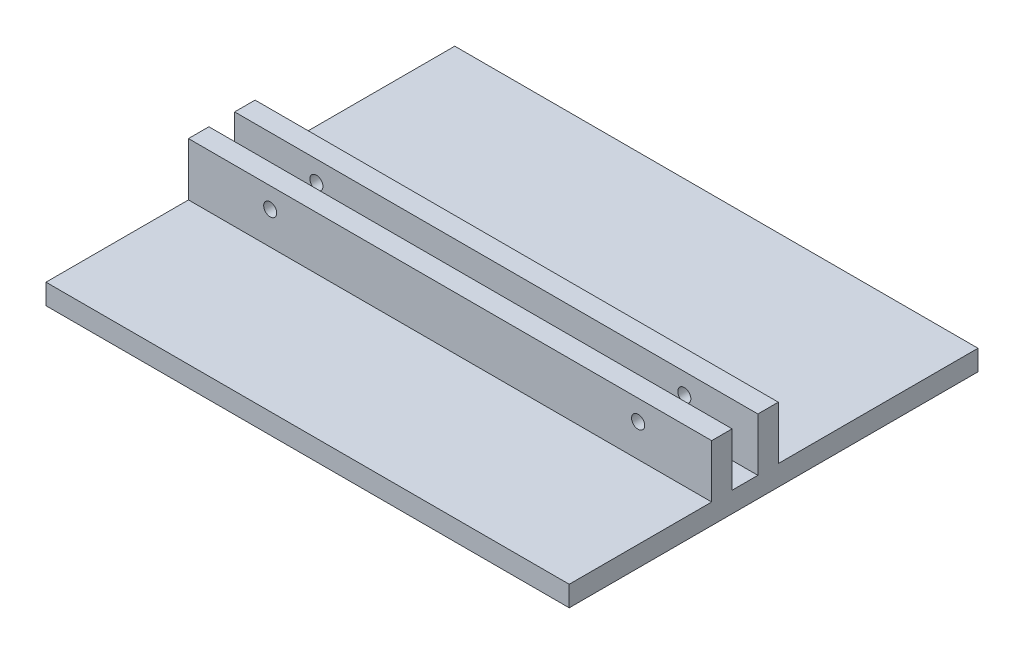
ISO-10303-21;
HEADER;
FILE_DESCRIPTION(('STEP AP214'),'2;1');
FILE_NAME('part.step','',(''),(''),'','','');
FILE_SCHEMA(('AUTOMOTIVE_DESIGN { 1 0 10303 214 1 1 1 1 }'));
ENDSEC;
DATA;
#1=APPLICATION_CONTEXT('core data for automotive mechanical design processes');
#2=APPLICATION_PROTOCOL_DEFINITION('international standard','automotive_design',2000,#1);
#3=PRODUCT_CONTEXT('',#1,'mechanical');
#4=PRODUCT('Part','Part','',(#3));
#5=PRODUCT_RELATED_PRODUCT_CATEGORY('part','',(#4));
#6=PRODUCT_DEFINITION_FORMATION('','',#4);
#7=PRODUCT_DEFINITION_CONTEXT('part definition',#1,'design');
#8=PRODUCT_DEFINITION('design','',#6,#7);
#9=PRODUCT_DEFINITION_SHAPE('','',#8);
#10=(LENGTH_UNIT() NAMED_UNIT(*) SI_UNIT(.MILLI.,.METRE.));
#11=(NAMED_UNIT(*) PLANE_ANGLE_UNIT() SI_UNIT($,.RADIAN.));
#12=(NAMED_UNIT(*) SI_UNIT($,.STERADIAN.) SOLID_ANGLE_UNIT());
#13=UNCERTAINTY_MEASURE_WITH_UNIT(LENGTH_MEASURE(1.E-05),#10,'distance_accuracy_value','');
#14=(GEOMETRIC_REPRESENTATION_CONTEXT(3) GLOBAL_UNCERTAINTY_ASSIGNED_CONTEXT((#13)) GLOBAL_UNIT_ASSIGNED_CONTEXT((#10,
#11,#12)) REPRESENTATION_CONTEXT('',''));
#15=CARTESIAN_POINT('',(0.,0.,0.));
#16=DIRECTION('',(0.,0.,1.));
#17=DIRECTION('',(1.,0.,0.));
#18=AXIS2_PLACEMENT_3D('',#15,#16,#17);
#19=CARTESIAN_POINT('',(40.,-77.,-23.));
#20=DIRECTION('',(0.,0.,1.));
#21=DIRECTION('',(1.,0.,0.));
#22=AXIS2_PLACEMENT_3D('',#19,#20,#21);
#23=CYLINDRICAL_SURFACE('',#22,1.6);
#24=DIRECTION('',(0.,0.,1.));
#25=VECTOR('',#24,1.);
#26=CARTESIAN_POINT('',(41.6,-77.,-23.));
#27=LINE('',#26,#25);
#28=CARTESIAN_POINT('',(41.6,-77.,0.15));
#29=VERTEX_POINT('',#28);
#30=CARTESIAN_POINT('',(41.6,-77.,5.15));
#31=VERTEX_POINT('',#30);
#32=EDGE_CURVE('E10',#29,#31,#27,.T.);
#33=ORIENTED_EDGE('',*,*,#32,.F.);
#34=CARTESIAN_POINT('',(40.,-77.,0.15));
#35=DIRECTION('',(0.,0.,1.));
#36=DIRECTION('',(1.,0.,0.));
#37=AXIS2_PLACEMENT_3D('',#34,#35,#36);
#38=CIRCLE('',#37,1.6);
#39=EDGE_CURVE('E246',#29,#29,#38,.T.);
#40=ORIENTED_EDGE('',*,*,#39,.F.);
#41=ORIENTED_EDGE('',*,*,#32,.T.);
#42=CARTESIAN_POINT('',(40.,-77.,5.15));
#43=DIRECTION('',(0.,0.,1.));
#44=DIRECTION('',(1.,0.,0.));
#45=AXIS2_PLACEMENT_3D('',#42,#43,#44);
#46=CIRCLE('',#45,1.6);
#47=EDGE_CURVE('E256',#31,#31,#46,.T.);
#48=ORIENTED_EDGE('',*,*,#47,.T.);
#49=EDGE_LOOP('',(#33,#40,#41,#48));
#50=FACE_BOUND('',#49,.T.);
#51=ADVANCED_FACE('F16',(#50),#23,.F.);
#52=CARTESIAN_POINT('',(-50.,-77.,-23.));
#53=DIRECTION('',(0.,0.,1.));
#54=DIRECTION('',(1.,0.,0.));
#55=AXIS2_PLACEMENT_3D('',#52,#53,#54);
#56=CYLINDRICAL_SURFACE('',#55,1.6);
#57=DIRECTION('',(0.,0.,1.));
#58=VECTOR('',#57,1.);
#59=CARTESIAN_POINT('',(-48.4,-77.,-23.));
#60=LINE('',#59,#58);
#61=CARTESIAN_POINT('',(-48.4,-77.,0.15));
#62=VERTEX_POINT('',#61);
#63=CARTESIAN_POINT('',(-48.4,-77.,5.15));
#64=VERTEX_POINT('',#63);
#65=EDGE_CURVE('E27',#62,#64,#60,.T.);
#66=ORIENTED_EDGE('',*,*,#65,.F.);
#67=CARTESIAN_POINT('',(-50.,-77.,0.15));
#68=DIRECTION('',(0.,0.,1.));
#69=DIRECTION('',(1.,0.,0.));
#70=AXIS2_PLACEMENT_3D('',#67,#68,#69);
#71=CIRCLE('',#70,1.6);
#72=EDGE_CURVE('E269',#62,#62,#71,.T.);
#73=ORIENTED_EDGE('',*,*,#72,.F.);
#74=ORIENTED_EDGE('',*,*,#65,.T.);
#75=CARTESIAN_POINT('',(-50.,-77.,5.15));
#76=DIRECTION('',(0.,0.,1.));
#77=DIRECTION('',(1.,0.,0.));
#78=AXIS2_PLACEMENT_3D('',#75,#76,#77);
#79=CIRCLE('',#78,1.6);
#80=EDGE_CURVE('E221',#64,#64,#79,.T.);
#81=ORIENTED_EDGE('',*,*,#80,.T.);
#82=EDGE_LOOP('',(#66,#73,#74,#81));
#83=FACE_BOUND('',#82,.T.);
#84=ADVANCED_FACE('F492',(#83),#56,.F.);
#85=CARTESIAN_POINT('',(40.,-77.,-23.));
#86=DIRECTION('',(0.,0.,1.));
#87=DIRECTION('',(1.,0.,0.));
#88=AXIS2_PLACEMENT_3D('',#85,#86,#87);
#89=CYLINDRICAL_SURFACE('',#88,1.6);
#90=DIRECTION('',(0.,0.,1.));
#91=VECTOR('',#90,1.);
#92=CARTESIAN_POINT('',(41.6,-77.,-23.));
#93=LINE('',#92,#91);
#94=CARTESIAN_POINT('',(41.6,-77.,-11.15));
#95=VERTEX_POINT('',#94);
#96=CARTESIAN_POINT('',(41.6,-77.,-6.15));
#97=VERTEX_POINT('',#96);
#98=EDGE_CURVE('E289',#95,#97,#93,.T.);
#99=ORIENTED_EDGE('',*,*,#98,.F.);
#100=CARTESIAN_POINT('',(40.,-77.,-11.15));
#101=DIRECTION('',(0.,0.,1.));
#102=DIRECTION('',(1.,0.,0.));
#103=AXIS2_PLACEMENT_3D('',#100,#101,#102);
#104=CIRCLE('',#103,1.6);
#105=EDGE_CURVE('E217',#95,#95,#104,.T.);
#106=ORIENTED_EDGE('',*,*,#105,.F.);
#107=ORIENTED_EDGE('',*,*,#98,.T.);
#108=CARTESIAN_POINT('',(40.,-77.,-6.15));
#109=DIRECTION('',(0.,0.,1.));
#110=DIRECTION('',(1.,0.,0.));
#111=AXIS2_PLACEMENT_3D('',#108,#109,#110);
#112=CIRCLE('',#111,1.6);
#113=EDGE_CURVE('E234',#97,#97,#112,.T.);
#114=ORIENTED_EDGE('',*,*,#113,.T.);
#115=EDGE_LOOP('',(#99,#106,#107,#114));
#116=FACE_BOUND('',#115,.T.);
#117=ADVANCED_FACE('F354',(#116),#89,.F.);
#118=CARTESIAN_POINT('',(-50.,-77.,-23.));
#119=DIRECTION('',(0.,0.,1.));
#120=DIRECTION('',(1.,0.,0.));
#121=AXIS2_PLACEMENT_3D('',#118,#119,#120);
#122=CYLINDRICAL_SURFACE('',#121,1.6);
#123=DIRECTION('',(0.,0.,1.));
#124=VECTOR('',#123,1.);
#125=CARTESIAN_POINT('',(-48.4,-77.,-23.));
#126=LINE('',#125,#124);
#127=CARTESIAN_POINT('',(-48.4,-77.,-11.15));
#128=VERTEX_POINT('',#127);
#129=CARTESIAN_POINT('',(-48.4,-77.,-6.15));
#130=VERTEX_POINT('',#129);
#131=EDGE_CURVE('E122',#128,#130,#126,.T.);
#132=ORIENTED_EDGE('',*,*,#131,.F.);
#133=CARTESIAN_POINT('',(-50.,-77.,-11.15));
#134=DIRECTION('',(0.,0.,1.));
#135=DIRECTION('',(1.,0.,0.));
#136=AXIS2_PLACEMENT_3D('',#133,#134,#135);
#137=CIRCLE('',#136,1.6);
#138=EDGE_CURVE('E197',#128,#128,#137,.T.);
#139=ORIENTED_EDGE('',*,*,#138,.F.);
#140=ORIENTED_EDGE('',*,*,#131,.T.);
#141=CARTESIAN_POINT('',(-50.,-77.,-6.15));
#142=DIRECTION('',(0.,0.,1.));
#143=DIRECTION('',(1.,0.,0.));
#144=AXIS2_PLACEMENT_3D('',#141,#142,#143);
#145=CIRCLE('',#144,1.6);
#146=EDGE_CURVE('E231',#130,#130,#145,.T.);
#147=ORIENTED_EDGE('',*,*,#146,.T.);
#148=EDGE_LOOP('',(#132,#139,#140,#147));
#149=FACE_BOUND('',#148,.T.);
#150=ADVANCED_FACE('F363',(#149),#122,.F.);
#151=CARTESIAN_POINT('',(58.,-90.,40.));
#152=DIRECTION('',(1.,0.,0.));
#153=DIRECTION('',(0.,1.,0.));
#154=AXIS2_PLACEMENT_3D('',#151,#152,#153);
#155=PLANE('',#154);
#156=DIRECTION('',(0.,1.,0.));
#157=VECTOR('',#156,1.);
#158=CARTESIAN_POINT('',(58.,-90.,40.));
#159=LINE('',#158,#157);
#160=CARTESIAN_POINT('',(58.,-90.,40.));
#161=VERTEX_POINT('',#160);
#162=CARTESIAN_POINT('',(58.,-85.,40.));
#163=VERTEX_POINT('',#162);
#164=EDGE_CURVE('E223',#161,#163,#159,.T.);
#165=ORIENTED_EDGE('',*,*,#164,.F.);
#166=DIRECTION('',(0.,0.,-1.));
#167=VECTOR('',#166,1.);
#168=CARTESIAN_POINT('',(58.,-90.,40.));
#169=LINE('',#168,#167);
#170=CARTESIAN_POINT('',(58.,-90.,-60.));
#171=VERTEX_POINT('',#170);
#172=EDGE_CURVE('E291',#161,#171,#169,.T.);
#173=ORIENTED_EDGE('',*,*,#172,.T.);
#174=DIRECTION('',(0.,1.,0.));
#175=VECTOR('',#174,1.);
#176=CARTESIAN_POINT('',(58.,-90.,-60.));
#177=LINE('',#176,#175);
#178=CARTESIAN_POINT('',(58.,-85.,-60.));
#179=VERTEX_POINT('',#178);
#180=EDGE_CURVE('E257',#171,#179,#177,.T.);
#181=ORIENTED_EDGE('',*,*,#180,.T.);
#182=DIRECTION('',(0.,0.,-1.));
#183=VECTOR('',#182,1.);
#184=CARTESIAN_POINT('',(58.,-85.,40.));
#185=LINE('',#184,#183);
#186=CARTESIAN_POINT('',(58.,-85.,-11.15));
#187=VERTEX_POINT('',#186);
#188=EDGE_CURVE('E193',#187,#179,#185,.T.);
#189=ORIENTED_EDGE('',*,*,#188,.F.);
#190=DIRECTION('',(0.,1.,0.));
#191=VECTOR('',#190,1.);
#192=CARTESIAN_POINT('',(58.,-85.,-11.15));
#193=LINE('',#192,#191);
#194=CARTESIAN_POINT('',(58.,-72.,-11.15));
#195=VERTEX_POINT('',#194);
#196=EDGE_CURVE('E189',#187,#195,#193,.T.);
#197=ORIENTED_EDGE('',*,*,#196,.T.);
#198=DIRECTION('',(0.,0.,-1.));
#199=VECTOR('',#198,1.);
#200=CARTESIAN_POINT('',(58.,-72.,-6.15));
#201=LINE('',#200,#199);
#202=CARTESIAN_POINT('',(58.,-72.,-6.15));
#203=VERTEX_POINT('',#202);
#204=EDGE_CURVE('E176',#203,#195,#201,.T.);
#205=ORIENTED_EDGE('',*,*,#204,.F.);
#206=DIRECTION('',(0.,1.,0.));
#207=VECTOR('',#206,1.);
#208=CARTESIAN_POINT('',(58.,-85.,-6.15));
#209=LINE('',#208,#207);
#210=CARTESIAN_POINT('',(58.,-85.,-6.15));
#211=VERTEX_POINT('',#210);
#212=EDGE_CURVE('E186',#211,#203,#209,.T.);
#213=ORIENTED_EDGE('',*,*,#212,.F.);
#214=DIRECTION('',(0.,0.,-1.));
#215=VECTOR('',#214,1.);
#216=CARTESIAN_POINT('',(58.,-85.,40.));
#217=LINE('',#216,#215);
#218=CARTESIAN_POINT('',(58.,-85.,0.15));
#219=VERTEX_POINT('',#218);
#220=EDGE_CURVE('E135',#219,#211,#217,.T.);
#221=ORIENTED_EDGE('',*,*,#220,.F.);
#222=DIRECTION('',(0.,1.,0.));
#223=VECTOR('',#222,1.);
#224=CARTESIAN_POINT('',(58.,-85.,0.15));
#225=LINE('',#224,#223);
#226=CARTESIAN_POINT('',(58.,-72.,0.15));
#227=VERTEX_POINT('',#226);
#228=EDGE_CURVE('E240',#219,#227,#225,.T.);
#229=ORIENTED_EDGE('',*,*,#228,.T.);
#230=DIRECTION('',(0.,0.,-1.));
#231=VECTOR('',#230,1.);
#232=CARTESIAN_POINT('',(58.,-72.,5.15));
#233=LINE('',#232,#231);
#234=CARTESIAN_POINT('',(58.,-72.,5.15));
#235=VERTEX_POINT('',#234);
#236=EDGE_CURVE('E245',#235,#227,#233,.T.);
#237=ORIENTED_EDGE('',*,*,#236,.F.);
#238=DIRECTION('',(0.,1.,0.));
#239=VECTOR('',#238,1.);
#240=CARTESIAN_POINT('',(58.,-85.,5.15));
#241=LINE('',#240,#239);
#242=CARTESIAN_POINT('',(58.,-85.,5.15));
#243=VERTEX_POINT('',#242);
#244=EDGE_CURVE('E222',#243,#235,#241,.T.);
#245=ORIENTED_EDGE('',*,*,#244,.F.);
#246=DIRECTION('',(0.,0.,-1.));
#247=VECTOR('',#246,1.);
#248=CARTESIAN_POINT('',(58.,-85.,40.));
#249=LINE('',#248,#247);
#250=EDGE_CURVE('E281',#163,#243,#249,.T.);
#251=ORIENTED_EDGE('',*,*,#250,.F.);
#252=EDGE_LOOP('',(#165,#173,#181,#189,#197,#205,#213,#221,#229,#237,#245,#251));
#253=FACE_BOUND('',#252,.T.);
#254=ADVANCED_FACE('F191',(#253),#155,.T.);
#255=CARTESIAN_POINT('',(-70.,-85.,40.));
#256=DIRECTION('',(0.,1.,0.));
#257=DIRECTION('',(1.,0.,0.));
#258=AXIS2_PLACEMENT_3D('',#255,#256,#257);
#259=PLANE('',#258);
#260=DIRECTION('',(0.,0.,-1.));
#261=VECTOR('',#260,1.);
#262=CARTESIAN_POINT('',(-70.,-85.,40.));
#263=LINE('',#262,#261);
#264=CARTESIAN_POINT('',(-70.,-85.,40.));
#265=VERTEX_POINT('',#264);
#266=CARTESIAN_POINT('',(-70.,-85.,5.15));
#267=VERTEX_POINT('',#266);
#268=EDGE_CURVE('E212',#265,#267,#263,.T.);
#269=ORIENTED_EDGE('',*,*,#268,.F.);
#270=DIRECTION('',(1.,0.,0.));
#271=VECTOR('',#270,1.);
#272=CARTESIAN_POINT('',(-70.,-85.,40.));
#273=LINE('',#272,#271);
#274=EDGE_CURVE('E88',#265,#163,#273,.T.);
#275=ORIENTED_EDGE('',*,*,#274,.T.);
#276=ORIENTED_EDGE('',*,*,#250,.T.);
#277=DIRECTION('',(1.,0.,0.));
#278=VECTOR('',#277,1.);
#279=CARTESIAN_POINT('',(-70.,-85.,5.15));
#280=LINE('',#279,#278);
#281=EDGE_CURVE('E100',#267,#243,#280,.T.);
#282=ORIENTED_EDGE('',*,*,#281,.F.);
#283=EDGE_LOOP('',(#269,#275,#276,#282));
#284=FACE_BOUND('',#283,.T.);
#285=ADVANCED_FACE('F397',(#284),#259,.T.);
#286=CARTESIAN_POINT('',(-70.,-85.,5.15));
#287=DIRECTION('',(0.,0.,-1.));
#288=DIRECTION('',(0.,-1.,0.));
#289=AXIS2_PLACEMENT_3D('',#286,#287,#288);
#290=PLANE('',#289);
#291=ORIENTED_EDGE('',*,*,#47,.F.);
#292=EDGE_LOOP('',(#291));
#293=FACE_BOUND('',#292,.T.);
#294=ORIENTED_EDGE('',*,*,#80,.F.);
#295=EDGE_LOOP('',(#294));
#296=FACE_BOUND('',#295,.T.);
#297=ORIENTED_EDGE('',*,*,#244,.T.);
#298=DIRECTION('',(1.,0.,0.));
#299=VECTOR('',#298,1.);
#300=CARTESIAN_POINT('',(-70.,-72.,5.15));
#301=LINE('',#300,#299);
#302=CARTESIAN_POINT('',(-70.,-72.,5.15));
#303=VERTEX_POINT('',#302);
#304=EDGE_CURVE('E241',#303,#235,#301,.T.);
#305=ORIENTED_EDGE('',*,*,#304,.F.);
#306=DIRECTION('',(0.,1.,0.));
#307=VECTOR('',#306,1.);
#308=CARTESIAN_POINT('',(-70.,-85.,5.15));
#309=LINE('',#308,#307);
#310=EDGE_CURVE('E215',#267,#303,#309,.T.);
#311=ORIENTED_EDGE('',*,*,#310,.F.);
#312=ORIENTED_EDGE('',*,*,#281,.T.);
#313=EDGE_LOOP('',(#297,#305,#311,#312));
#314=FACE_BOUND('',#313,.T.);
#315=ADVANCED_FACE('F431',(#293,#296,#314),#290,.F.);
#316=CARTESIAN_POINT('',(-70.,-72.,5.15));
#317=DIRECTION('',(0.,1.,0.));
#318=DIRECTION('',(1.,0.,0.));
#319=AXIS2_PLACEMENT_3D('',#316,#317,#318);
#320=PLANE('',#319);
#321=DIRECTION('',(0.,0.,-1.));
#322=VECTOR('',#321,1.);
#323=CARTESIAN_POINT('',(-70.,-72.,5.15));
#324=LINE('',#323,#322);
#325=CARTESIAN_POINT('',(-70.,-72.,0.15));
#326=VERTEX_POINT('',#325);
#327=EDGE_CURVE('E230',#303,#326,#324,.T.);
#328=ORIENTED_EDGE('',*,*,#327,.F.);
#329=ORIENTED_EDGE('',*,*,#304,.T.);
#330=ORIENTED_EDGE('',*,*,#236,.T.);
#331=DIRECTION('',(1.,0.,0.));
#332=VECTOR('',#331,1.);
#333=CARTESIAN_POINT('',(-70.,-72.,0.15));
#334=LINE('',#333,#332);
#335=EDGE_CURVE('E236',#326,#227,#334,.T.);
#336=ORIENTED_EDGE('',*,*,#335,.F.);
#337=EDGE_LOOP('',(#328,#329,#330,#336));
#338=FACE_BOUND('',#337,.T.);
#339=ADVANCED_FACE('F430',(#338),#320,.T.);
#340=CARTESIAN_POINT('',(-70.,-85.,0.15));
#341=DIRECTION('',(0.,0.,-1.));
#342=DIRECTION('',(0.,-1.,0.));
#343=AXIS2_PLACEMENT_3D('',#340,#341,#342);
#344=PLANE('',#343);
#345=ORIENTED_EDGE('',*,*,#39,.T.);
#346=EDGE_LOOP('',(#345));
#347=FACE_BOUND('',#346,.T.);
#348=ORIENTED_EDGE('',*,*,#72,.T.);
#349=EDGE_LOOP('',(#348));
#350=FACE_BOUND('',#349,.T.);
#351=DIRECTION('',(1.,0.,0.));
#352=VECTOR('',#351,1.);
#353=CARTESIAN_POINT('',(-70.,-85.,0.15));
#354=LINE('',#353,#352);
#355=CARTESIAN_POINT('',(-70.,-85.,0.15));
#356=VERTEX_POINT('',#355);
#357=EDGE_CURVE('E287',#356,#219,#354,.T.);
#358=ORIENTED_EDGE('',*,*,#357,.F.);
#359=DIRECTION('',(0.,1.,0.));
#360=VECTOR('',#359,1.);
#361=CARTESIAN_POINT('',(-70.,-85.,0.15));
#362=LINE('',#361,#360);
#363=EDGE_CURVE('E270',#356,#326,#362,.T.);
#364=ORIENTED_EDGE('',*,*,#363,.T.);
#365=ORIENTED_EDGE('',*,*,#335,.T.);
#366=ORIENTED_EDGE('',*,*,#228,.F.);
#367=EDGE_LOOP('',(#358,#364,#365,#366));
#368=FACE_BOUND('',#367,.T.);
#369=ADVANCED_FACE('F377',(#347,#350,#368),#344,.T.);
#370=CARTESIAN_POINT('',(-70.,-85.,40.));
#371=DIRECTION('',(0.,1.,0.));
#372=DIRECTION('',(1.,0.,0.));
#373=AXIS2_PLACEMENT_3D('',#370,#371,#372);
#374=PLANE('',#373);
#375=DIRECTION('',(0.,0.,-1.));
#376=VECTOR('',#375,1.);
#377=CARTESIAN_POINT('',(-70.,-85.,40.));
#378=LINE('',#377,#376);
#379=CARTESIAN_POINT('',(-70.,-85.,-6.15));
#380=VERTEX_POINT('',#379);
#381=EDGE_CURVE('E274',#356,#380,#378,.T.);
#382=ORIENTED_EDGE('',*,*,#381,.F.);
#383=ORIENTED_EDGE('',*,*,#357,.T.);
#384=ORIENTED_EDGE('',*,*,#220,.T.);
#385=DIRECTION('',(1.,0.,0.));
#386=VECTOR('',#385,1.);
#387=CARTESIAN_POINT('',(-70.,-85.,-6.15));
#388=LINE('',#387,#386);
#389=EDGE_CURVE('E235',#380,#211,#388,.T.);
#390=ORIENTED_EDGE('',*,*,#389,.F.);
#391=EDGE_LOOP('',(#382,#383,#384,#390));
#392=FACE_BOUND('',#391,.T.);
#393=ADVANCED_FACE('F369',(#392),#374,.T.);
#394=CARTESIAN_POINT('',(-70.,-85.,-6.15));
#395=DIRECTION('',(0.,0.,-1.));
#396=DIRECTION('',(0.,-1.,0.));
#397=AXIS2_PLACEMENT_3D('',#394,#395,#396);
#398=PLANE('',#397);
#399=ORIENTED_EDGE('',*,*,#113,.F.);
#400=EDGE_LOOP('',(#399));
#401=FACE_BOUND('',#400,.T.);
#402=ORIENTED_EDGE('',*,*,#146,.F.);
#403=EDGE_LOOP('',(#402));
#404=FACE_BOUND('',#403,.T.);
#405=ORIENTED_EDGE('',*,*,#212,.T.);
#406=DIRECTION('',(1.,0.,0.));
#407=VECTOR('',#406,1.);
#408=CARTESIAN_POINT('',(-70.,-72.,-6.15));
#409=LINE('',#408,#407);
#410=CARTESIAN_POINT('',(-70.,-72.,-6.15));
#411=VERTEX_POINT('',#410);
#412=EDGE_CURVE('E182',#411,#203,#409,.T.);
#413=ORIENTED_EDGE('',*,*,#412,.F.);
#414=DIRECTION('',(0.,1.,0.));
#415=VECTOR('',#414,1.);
#416=CARTESIAN_POINT('',(-70.,-85.,-6.15));
#417=LINE('',#416,#415);
#418=EDGE_CURVE('E310',#380,#411,#417,.T.);
#419=ORIENTED_EDGE('',*,*,#418,.F.);
#420=ORIENTED_EDGE('',*,*,#389,.T.);
#421=EDGE_LOOP('',(#405,#413,#419,#420));
#422=FACE_BOUND('',#421,.T.);
#423=ADVANCED_FACE('F366',(#401,#404,#422),#398,.F.);
#424=CARTESIAN_POINT('',(-70.,-72.,-6.15));
#425=DIRECTION('',(0.,1.,0.));
#426=DIRECTION('',(1.,0.,0.));
#427=AXIS2_PLACEMENT_3D('',#424,#425,#426);
#428=PLANE('',#427);
#429=DIRECTION('',(0.,0.,-1.));
#430=VECTOR('',#429,1.);
#431=CARTESIAN_POINT('',(-70.,-72.,-6.15));
#432=LINE('',#431,#430);
#433=CARTESIAN_POINT('',(-70.,-72.,-11.15));
#434=VERTEX_POINT('',#433);
#435=EDGE_CURVE('E263',#411,#434,#432,.T.);
#436=ORIENTED_EDGE('',*,*,#435,.F.);
#437=ORIENTED_EDGE('',*,*,#412,.T.);
#438=ORIENTED_EDGE('',*,*,#204,.T.);
#439=DIRECTION('',(1.,0.,0.));
#440=VECTOR('',#439,1.);
#441=CARTESIAN_POINT('',(-70.,-72.,-11.15));
#442=LINE('',#441,#440);
#443=EDGE_CURVE('E180',#434,#195,#442,.T.);
#444=ORIENTED_EDGE('',*,*,#443,.F.);
#445=EDGE_LOOP('',(#436,#437,#438,#444));
#446=FACE_BOUND('',#445,.T.);
#447=ADVANCED_FACE('F18',(#446),#428,.T.);
#448=CARTESIAN_POINT('',(-70.,-85.,-11.15));
#449=DIRECTION('',(0.,0.,-1.));
#450=DIRECTION('',(0.,-1.,0.));
#451=AXIS2_PLACEMENT_3D('',#448,#449,#450);
#452=PLANE('',#451);
#453=ORIENTED_EDGE('',*,*,#105,.T.);
#454=EDGE_LOOP('',(#453));
#455=FACE_BOUND('',#454,.T.);
#456=ORIENTED_EDGE('',*,*,#138,.T.);
#457=EDGE_LOOP('',(#456));
#458=FACE_BOUND('',#457,.T.);
#459=DIRECTION('',(1.,0.,0.));
#460=VECTOR('',#459,1.);
#461=CARTESIAN_POINT('',(-70.,-85.,-11.15));
#462=LINE('',#461,#460);
#463=CARTESIAN_POINT('',(-70.,-85.,-11.15));
#464=VERTEX_POINT('',#463);
#465=EDGE_CURVE('E208',#464,#187,#462,.T.);
#466=ORIENTED_EDGE('',*,*,#465,.F.);
#467=DIRECTION('',(0.,1.,0.));
#468=VECTOR('',#467,1.);
#469=CARTESIAN_POINT('',(-70.,-85.,-11.15));
#470=LINE('',#469,#468);
#471=EDGE_CURVE('E201',#464,#434,#470,.T.);
#472=ORIENTED_EDGE('',*,*,#471,.T.);
#473=ORIENTED_EDGE('',*,*,#443,.T.);
#474=ORIENTED_EDGE('',*,*,#196,.F.);
#475=EDGE_LOOP('',(#466,#472,#473,#474));
#476=FACE_BOUND('',#475,.T.);
#477=ADVANCED_FACE('F199',(#455,#458,#476),#452,.T.);
#478=CARTESIAN_POINT('',(-70.,-85.,40.));
#479=DIRECTION('',(0.,1.,0.));
#480=DIRECTION('',(1.,0.,0.));
#481=AXIS2_PLACEMENT_3D('',#478,#479,#480);
#482=PLANE('',#481);
#483=DIRECTION('',(0.,0.,-1.));
#484=VECTOR('',#483,1.);
#485=CARTESIAN_POINT('',(-70.,-85.,40.));
#486=LINE('',#485,#484);
#487=CARTESIAN_POINT('',(-70.,-85.,-60.));
#488=VERTEX_POINT('',#487);
#489=EDGE_CURVE('E252',#464,#488,#486,.T.);
#490=ORIENTED_EDGE('',*,*,#489,.F.);
#491=ORIENTED_EDGE('',*,*,#465,.T.);
#492=ORIENTED_EDGE('',*,*,#188,.T.);
#493=DIRECTION('',(1.,0.,0.));
#494=VECTOR('',#493,1.);
#495=CARTESIAN_POINT('',(-70.,-85.,-60.));
#496=LINE('',#495,#494);
#497=EDGE_CURVE('E260',#488,#179,#496,.T.);
#498=ORIENTED_EDGE('',*,*,#497,.F.);
#499=EDGE_LOOP('',(#490,#491,#492,#498));
#500=FACE_BOUND('',#499,.T.);
#501=ADVANCED_FACE('F361',(#500),#482,.T.);
#502=CARTESIAN_POINT('',(-70.,-90.,-60.));
#503=DIRECTION('',(0.,0.,-1.));
#504=DIRECTION('',(0.,-1.,0.));
#505=AXIS2_PLACEMENT_3D('',#502,#503,#504);
#506=PLANE('',#505);
#507=DIRECTION('',(1.,0.,0.));
#508=VECTOR('',#507,1.);
#509=CARTESIAN_POINT('',(-70.,-90.,-60.));
#510=LINE('',#509,#508);
#511=CARTESIAN_POINT('',(-70.,-90.,-60.));
#512=VERTEX_POINT('',#511);
#513=EDGE_CURVE('E20',#512,#171,#510,.T.);
#514=ORIENTED_EDGE('',*,*,#513,.F.);
#515=DIRECTION('',(0.,1.,0.));
#516=VECTOR('',#515,1.);
#517=CARTESIAN_POINT('',(-70.,-90.,-60.));
#518=LINE('',#517,#516);
#519=EDGE_CURVE('E247',#512,#488,#518,.T.);
#520=ORIENTED_EDGE('',*,*,#519,.T.);
#521=ORIENTED_EDGE('',*,*,#497,.T.);
#522=ORIENTED_EDGE('',*,*,#180,.F.);
#523=EDGE_LOOP('',(#514,#520,#521,#522));
#524=FACE_BOUND('',#523,.T.);
#525=ADVANCED_FACE('F393',(#524),#506,.T.);
#526=CARTESIAN_POINT('',(-70.,-90.,40.));
#527=DIRECTION('',(0.,1.,0.));
#528=DIRECTION('',(1.,0.,0.));
#529=AXIS2_PLACEMENT_3D('',#526,#527,#528);
#530=PLANE('',#529);
#531=ORIENTED_EDGE('',*,*,#513,.T.);
#532=ORIENTED_EDGE('',*,*,#172,.F.);
#533=DIRECTION('',(1.,0.,0.));
#534=VECTOR('',#533,1.);
#535=CARTESIAN_POINT('',(-70.,-90.,40.));
#536=LINE('',#535,#534);
#537=CARTESIAN_POINT('',(-70.,-90.,40.));
#538=VERTEX_POINT('',#537);
#539=EDGE_CURVE('E275',#538,#161,#536,.T.);
#540=ORIENTED_EDGE('',*,*,#539,.F.);
#541=DIRECTION('',(0.,0.,-1.));
#542=VECTOR('',#541,1.);
#543=CARTESIAN_POINT('',(-70.,-90.,40.));
#544=LINE('',#543,#542);
#545=EDGE_CURVE('E251',#538,#512,#544,.T.);
#546=ORIENTED_EDGE('',*,*,#545,.T.);
#547=EDGE_LOOP('',(#531,#532,#540,#546));
#548=FACE_BOUND('',#547,.T.);
#549=ADVANCED_FACE('F396',(#548),#530,.F.);
#550=CARTESIAN_POINT('',(-70.,-90.,40.));
#551=DIRECTION('',(0.,0.,-1.));
#552=DIRECTION('',(0.,-1.,0.));
#553=AXIS2_PLACEMENT_3D('',#550,#551,#552);
#554=PLANE('',#553);
#555=ORIENTED_EDGE('',*,*,#164,.T.);
#556=ORIENTED_EDGE('',*,*,#274,.F.);
#557=DIRECTION('',(0.,1.,0.));
#558=VECTOR('',#557,1.);
#559=CARTESIAN_POINT('',(-70.,-90.,40.));
#560=LINE('',#559,#558);
#561=EDGE_CURVE('E226',#538,#265,#560,.T.);
#562=ORIENTED_EDGE('',*,*,#561,.F.);
#563=ORIENTED_EDGE('',*,*,#539,.T.);
#564=EDGE_LOOP('',(#555,#556,#562,#563));
#565=FACE_BOUND('',#564,.T.);
#566=ADVANCED_FACE('F398',(#565),#554,.F.);
#567=CARTESIAN_POINT('',(-70.,-90.,40.));
#568=DIRECTION('',(1.,0.,0.));
#569=DIRECTION('',(0.,1.,0.));
#570=AXIS2_PLACEMENT_3D('',#567,#568,#569);
#571=PLANE('',#570);
#572=ORIENTED_EDGE('',*,*,#268,.T.);
#573=ORIENTED_EDGE('',*,*,#310,.T.);
#574=ORIENTED_EDGE('',*,*,#327,.T.);
#575=ORIENTED_EDGE('',*,*,#363,.F.);
#576=ORIENTED_EDGE('',*,*,#381,.T.);
#577=ORIENTED_EDGE('',*,*,#418,.T.);
#578=ORIENTED_EDGE('',*,*,#435,.T.);
#579=ORIENTED_EDGE('',*,*,#471,.F.);
#580=ORIENTED_EDGE('',*,*,#489,.T.);
#581=ORIENTED_EDGE('',*,*,#519,.F.);
#582=ORIENTED_EDGE('',*,*,#545,.F.);
#583=ORIENTED_EDGE('',*,*,#561,.T.);
#584=EDGE_LOOP('',(#572,#573,#574,#575,#576,#577,#578,#579,#580,#581,#582,#583));
#585=FACE_BOUND('',#584,.T.);
#586=ADVANCED_FACE('F389',(#585),#571,.F.);
#587=CLOSED_SHELL('',(#51,#84,#117,#150,#254,#285,#315,#339,#369,#393,#423,#447,#477,#501,#525,
#549,#566,#586));
#588=MANIFOLD_SOLID_BREP('B1',#587);
#589=ADVANCED_BREP_SHAPE_REPRESENTATION('',(#18,#588),#14);
#590=SHAPE_DEFINITION_REPRESENTATION(#9,#589);
ENDSEC;
END-ISO-10303-21;
